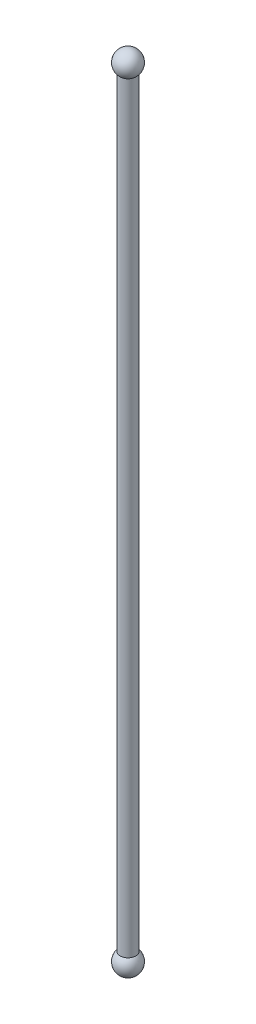
ISO-10303-21;
HEADER;
FILE_DESCRIPTION(('STEP AP214'),'2;1');
FILE_NAME('part.step','',(''),(''),'','','');
FILE_SCHEMA(('AUTOMOTIVE_DESIGN { 1 0 10303 214 1 1 1 1 }'));
ENDSEC;
DATA;
#1=APPLICATION_CONTEXT('core data for automotive mechanical design processes');
#2=APPLICATION_PROTOCOL_DEFINITION('international standard','automotive_design',2000,#1);
#3=PRODUCT_CONTEXT('',#1,'mechanical');
#4=PRODUCT('Part','Part','',(#3));
#5=PRODUCT_RELATED_PRODUCT_CATEGORY('part','',(#4));
#6=PRODUCT_DEFINITION_FORMATION('','',#4);
#7=PRODUCT_DEFINITION_CONTEXT('part definition',#1,'design');
#8=PRODUCT_DEFINITION('design','',#6,#7);
#9=PRODUCT_DEFINITION_SHAPE('','',#8);
#10=(LENGTH_UNIT() NAMED_UNIT(*) SI_UNIT(.MILLI.,.METRE.));
#11=(NAMED_UNIT(*) PLANE_ANGLE_UNIT() SI_UNIT($,.RADIAN.));
#12=(NAMED_UNIT(*) SI_UNIT($,.STERADIAN.) SOLID_ANGLE_UNIT());
#13=UNCERTAINTY_MEASURE_WITH_UNIT(LENGTH_MEASURE(1.E-05),#10,'distance_accuracy_value','');
#14=(GEOMETRIC_REPRESENTATION_CONTEXT(3) GLOBAL_UNCERTAINTY_ASSIGNED_CONTEXT((#13)) GLOBAL_UNIT_ASSIGNED_CONTEXT((#10,
#11,#12)) REPRESENTATION_CONTEXT('',''));
#15=CARTESIAN_POINT('',(0.,0.,0.));
#16=DIRECTION('',(0.,0.,1.));
#17=DIRECTION('',(1.,0.,0.));
#18=AXIS2_PLACEMENT_3D('',#15,#16,#17);
#19=CARTESIAN_POINT('',(0.,250.,0.));
#20=DIRECTION('',(0.,-1.,0.));
#21=DIRECTION('',(0.,0.,-1.));
#22=AXIS2_PLACEMENT_3D('',#19,#20,#21);
#23=CYLINDRICAL_SURFACE('',#22,5.);
#24=CARTESIAN_POINT('',(0.,244.409830056251,0.));
#25=DIRECTION('',(0.,0.999999999999998,0.));
#26=DIRECTION('',(0.,0.,1.));
#27=AXIS2_PLACEMENT_3D('',#24,#25,#26);
#28=CIRCLE('',#27,5.);
#29=CARTESIAN_POINT('',(0.,244.409830056251,5.));
#30=VERTEX_POINT('',#29);
#31=EDGE_CURVE('E47',#30,#30,#28,.T.);
#32=ORIENTED_EDGE('',*,*,#31,.F.);
#33=EDGE_LOOP('',(#32));
#34=FACE_BOUND('',#33,.T.);
#35=CARTESIAN_POINT('',(0.,-244.409830056251,0.));
#36=DIRECTION('',(0.,-1.,0.));
#37=DIRECTION('',(0.,0.,-1.));
#38=AXIS2_PLACEMENT_3D('',#35,#36,#37);
#39=CIRCLE('',#38,5.);
#40=CARTESIAN_POINT('',(0.,-244.409830056251,-5.));
#41=VERTEX_POINT('',#40);
#42=EDGE_CURVE('E10',#41,#41,#39,.T.);
#43=ORIENTED_EDGE('',*,*,#42,.F.);
#44=EDGE_LOOP('',(#43));
#45=FACE_BOUND('',#44,.T.);
#46=ADVANCED_FACE('F41',(#34,#45),#23,.T.);
#47=CARTESIAN_POINT('',(0.,250.,0.));
#48=DIRECTION('',(0.,1.,0.));
#49=DIRECTION('',(1.,0.,0.));
#50=AXIS2_PLACEMENT_3D('',#47,#48,#49);
#51=SPHERICAL_SURFACE('',#50,7.50000000000001);
#52=ORIENTED_EDGE('',*,*,#31,.T.);
#53=EDGE_LOOP('',(#52));
#54=FACE_BOUND('',#53,.T.);
#55=ADVANCED_FACE('F53',(#54),#51,.T.);
#56=CARTESIAN_POINT('',(0.,-250.,0.));
#57=DIRECTION('',(0.,-1.,0.));
#58=DIRECTION('',(1.,0.,0.));
#59=AXIS2_PLACEMENT_3D('',#56,#57,#58);
#60=SPHERICAL_SURFACE('',#59,7.50000000000001);
#61=ORIENTED_EDGE('',*,*,#42,.T.);
#62=EDGE_LOOP('',(#61));
#63=FACE_BOUND('',#62,.T.);
#64=ADVANCED_FACE('F60',(#63),#60,.T.);
#65=CLOSED_SHELL('',(#46,#55,#64));
#66=MANIFOLD_SOLID_BREP('B2',#65);
#67=ADVANCED_BREP_SHAPE_REPRESENTATION('',(#18,#66),#14);
#68=SHAPE_DEFINITION_REPRESENTATION(#9,#67);
ENDSEC;
END-ISO-10303-21;
